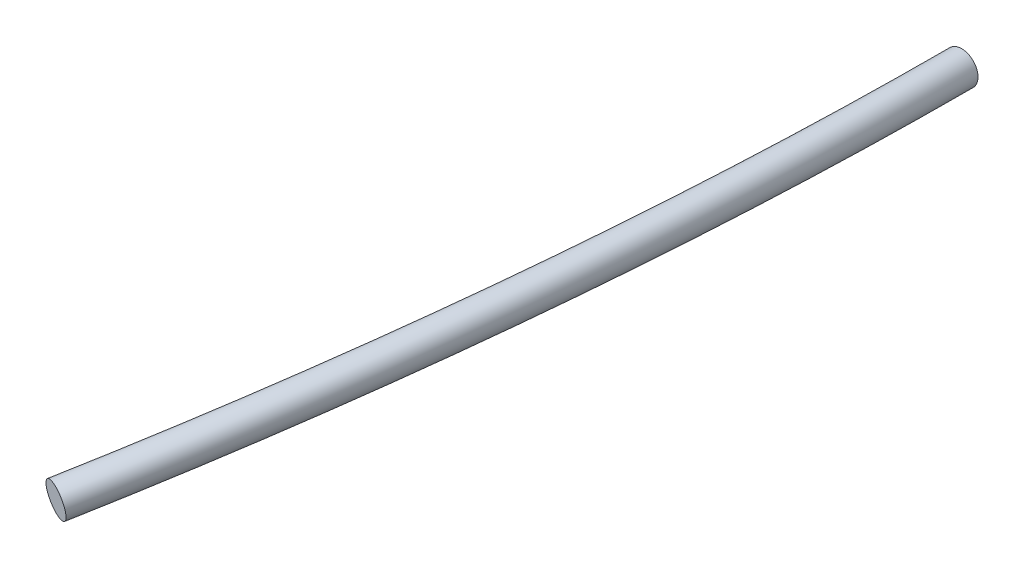
ISO-10303-21;
HEADER;
FILE_DESCRIPTION(('STEP AP214'),'2;1');
FILE_NAME('part.step','',(''),(''),'','','');
FILE_SCHEMA(('AUTOMOTIVE_DESIGN { 1 0 10303 214 1 1 1 1 }'));
ENDSEC;
DATA;
#1=APPLICATION_CONTEXT('core data for automotive mechanical design processes');
#2=APPLICATION_PROTOCOL_DEFINITION('international standard','automotive_design',2000,#1);
#3=PRODUCT_CONTEXT('',#1,'mechanical');
#4=PRODUCT('Part','Part','',(#3));
#5=PRODUCT_RELATED_PRODUCT_CATEGORY('part','',(#4));
#6=PRODUCT_DEFINITION_FORMATION('','',#4);
#7=PRODUCT_DEFINITION_CONTEXT('part definition',#1,'design');
#8=PRODUCT_DEFINITION('design','',#6,#7);
#9=PRODUCT_DEFINITION_SHAPE('','',#8);
#10=(LENGTH_UNIT() NAMED_UNIT(*) SI_UNIT(.MILLI.,.METRE.));
#11=(NAMED_UNIT(*) PLANE_ANGLE_UNIT() SI_UNIT($,.RADIAN.));
#12=(NAMED_UNIT(*) SI_UNIT($,.STERADIAN.) SOLID_ANGLE_UNIT());
#13=UNCERTAINTY_MEASURE_WITH_UNIT(LENGTH_MEASURE(1.E-05),#10,'distance_accuracy_value','');
#14=(GEOMETRIC_REPRESENTATION_CONTEXT(3) GLOBAL_UNCERTAINTY_ASSIGNED_CONTEXT((#13)) GLOBAL_UNIT_ASSIGNED_CONTEXT((#10,
#11,#12)) REPRESENTATION_CONTEXT('',''));
#15=CARTESIAN_POINT('',(0.,0.,0.));
#16=DIRECTION('',(0.,0.,1.));
#17=DIRECTION('',(1.,0.,0.));
#18=AXIS2_PLACEMENT_3D('',#15,#16,#17);
#19=CARTESIAN_POINT('',(-1842.95228693971,4288.36913287182,9.76996261670138E-12));
#20=DIRECTION('',(-0.40437698384415,0.91459239825023,0.));
#21=DIRECTION('',(-0.91459239825023,-0.40437698384415,0.));
#22=AXIS2_PLACEMENT_3D('',#19,#20,#21);
#23=TOROIDAL_SURFACE('',#22,6165.09238276191,50.7999999999939);
#24=CARTESIAN_POINT('',(3360.28401029647,6588.92291413024,2375.32069890581));
#25=DIRECTION('',(-0.352379189109968,-0.155800588255874,0.922797422938169));
#26=DIRECTION('',(0.935421645860095,-0.028552610013679,0.352379189109968));
#27=AXIS2_PLACEMENT_3D('',#24,#25,#26);
#28=CIRCLE('',#27,50.7999999999939);
#29=CARTESIAN_POINT('',(3403.15837251019,6607.87934249045,2394.89320228659));
#30=VERTEX_POINT('',#29);
#31=EDGE_CURVE('E10',#30,#30,#28,.T.);
#32=CARTESIAN_POINT('',(3795.59434084472,6781.39059573363,0.));
#33=DIRECTION('',(0.,0.,1.));
#34=DIRECTION('',(1.,0.,0.));
#35=AXIS2_PLACEMENT_3D('',#32,#33,#34);
#36=CIRCLE('',#35,50.7999999999939);
#37=CARTESIAN_POINT('',(3842.05563467583,6801.9329465129,0.));
#38=VERTEX_POINT('',#37);
#39=EDGE_CURVE('E37',#38,#38,#36,.T.);
#40=CARTESIAN_POINT('',(-1842.95228693971,4288.36913287182,9.76996261670138E-12));
#41=DIRECTION('',(-0.40437698384415,0.91459239825023,0.));
#42=DIRECTION('',(-0.91459239825023,-0.40437698384415,0.));
#43=AXIS2_PLACEMENT_3D('',#40,#41,#42);
#44=CIRCLE('',#43,6215.8923827619);
#45=EDGE_CURVE('',#30,#38,#44,.T.);
#46=ORIENTED_EDGE('',*,*,#31,.F.);
#47=ORIENTED_EDGE('',*,*,#39,.T.);
#48=ORIENTED_EDGE('',*,*,#45,.T.);
#49=ORIENTED_EDGE('',*,*,#45,.F.);
#50=EDGE_LOOP('',(#46,#48,#47,#49));
#51=FACE_BOUND('',#50,.T.);
#52=ADVANCED_FACE('F31',(#51),#23,.T.);
#53=CARTESIAN_POINT('',(3360.28401029647,6588.92291413024,2375.32069890581));
#54=DIRECTION('',(-0.352379189109968,-0.155800588255874,0.922797422938169));
#55=DIRECTION('',(0.935421645860095,-0.028552610013679,0.352379189109968));
#56=AXIS2_PLACEMENT_3D('',#53,#54,#55);
#57=PLANE('',#56);
#58=ORIENTED_EDGE('',*,*,#31,.T.);
#59=EDGE_LOOP('',(#58));
#60=FACE_BOUND('',#59,.T.);
#61=ADVANCED_FACE('F46',(#60),#57,.T.);
#62=CARTESIAN_POINT('',(3795.59434084472,6781.39059573363,0.));
#63=DIRECTION('',(0.,0.,1.));
#64=DIRECTION('',(1.,0.,0.));
#65=AXIS2_PLACEMENT_3D('',#62,#63,#64);
#66=PLANE('',#65);
#67=ORIENTED_EDGE('',*,*,#39,.F.);
#68=EDGE_LOOP('',(#67));
#69=FACE_BOUND('',#68,.T.);
#70=ADVANCED_FACE('F44',(#69),#66,.F.);
#71=CLOSED_SHELL('',(#52,#61,#70));
#72=MANIFOLD_SOLID_BREP('B2',#71);
#73=ADVANCED_BREP_SHAPE_REPRESENTATION('',(#18,#72),#14);
#74=SHAPE_DEFINITION_REPRESENTATION(#9,#73);
ENDSEC;
END-ISO-10303-21;
